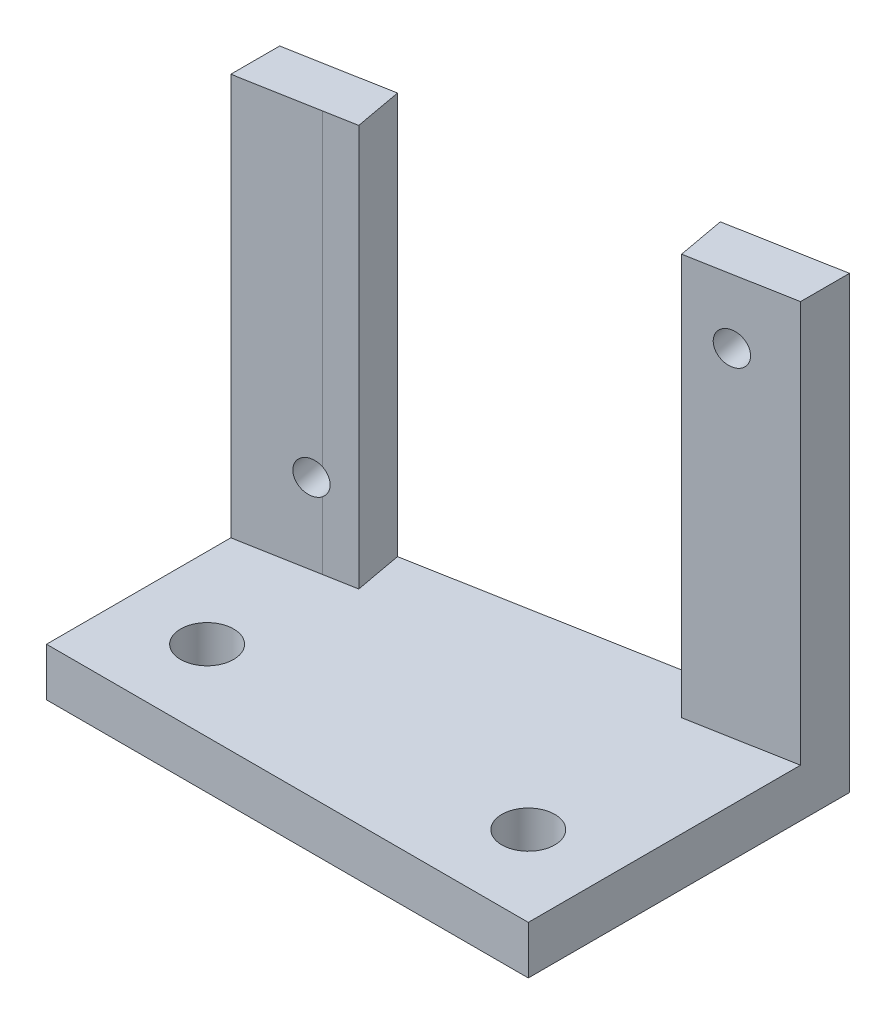
ISO-10303-21;
HEADER;
FILE_DESCRIPTION(('STEP AP214'),'2;1');
FILE_NAME('part.step','',(''),(''),'','','');
FILE_SCHEMA(('AUTOMOTIVE_DESIGN { 1 0 10303 214 1 1 1 1 }'));
ENDSEC;
DATA;
#1=APPLICATION_CONTEXT('core data for automotive mechanical design processes');
#2=APPLICATION_PROTOCOL_DEFINITION('international standard','automotive_design',2000,#1);
#3=PRODUCT_CONTEXT('',#1,'mechanical');
#4=PRODUCT('Part','Part','',(#3));
#5=PRODUCT_RELATED_PRODUCT_CATEGORY('part','',(#4));
#6=PRODUCT_DEFINITION_FORMATION('','',#4);
#7=PRODUCT_DEFINITION_CONTEXT('part definition',#1,'design');
#8=PRODUCT_DEFINITION('design','',#6,#7);
#9=PRODUCT_DEFINITION_SHAPE('','',#8);
#10=(LENGTH_UNIT() NAMED_UNIT(*) SI_UNIT(.MILLI.,.METRE.));
#11=(NAMED_UNIT(*) PLANE_ANGLE_UNIT() SI_UNIT($,.RADIAN.));
#12=(NAMED_UNIT(*) SI_UNIT($,.STERADIAN.) SOLID_ANGLE_UNIT());
#13=UNCERTAINTY_MEASURE_WITH_UNIT(LENGTH_MEASURE(1.E-05),#10,'distance_accuracy_value','');
#14=(GEOMETRIC_REPRESENTATION_CONTEXT(3) GLOBAL_UNCERTAINTY_ASSIGNED_CONTEXT((#13)) GLOBAL_UNIT_ASSIGNED_CONTEXT((#10,
#11,#12)) REPRESENTATION_CONTEXT('',''));
#15=CARTESIAN_POINT('',(0.,0.,0.));
#16=DIRECTION('',(0.,0.,1.));
#17=DIRECTION('',(1.,0.,0.));
#18=AXIS2_PLACEMENT_3D('',#15,#16,#17);
#19=CARTESIAN_POINT('',(-1.62852563895686,28.,-8.91157755402289));
#20=DIRECTION('',(0.179765710063965,0.,0.983709453794767));
#21=DIRECTION('',(0.983709453794767,0.,-0.179765710063965));
#22=AXIS2_PLACEMENT_3D('',#19,#20,#21);
#23=PLANE('',#22);
#24=DIRECTION('',(0.,-1.,0.));
#25=VECTOR('',#24,1.);
#26=CARTESIAN_POINT('',(-8.2550015506538,28.,-7.70063753215696));
#27=LINE('',#26,#25);
#28=CARTESIAN_POINT('',(-8.2550015506538,28.,-7.70063753215696));
#29=VERTEX_POINT('',#28);
#30=CARTESIAN_POINT('',(-8.2550015506538,3.,-7.70063753215696));
#31=VERTEX_POINT('',#30);
#32=EDGE_CURVE('E143',#29,#31,#27,.T.);
#33=ORIENTED_EDGE('',*,*,#32,.F.);
#34=DIRECTION('',(-0.983709453794767,0.,0.179765710063965));
#35=VECTOR('',#34,1.);
#36=CARTESIAN_POINT('',(-1.62852563895686,28.,-8.91157755402289));
#37=LINE('',#36,#35);
#38=CARTESIAN_POINT('',(-10.171425838547,28.,-7.3504250059197));
#39=VERTEX_POINT('',#38);
#40=EDGE_CURVE('E291',#29,#39,#37,.T.);
#41=ORIENTED_EDGE('',*,*,#40,.T.);
#42=DIRECTION('',(0.,-1.,0.));
#43=VECTOR('',#42,1.);
#44=CARTESIAN_POINT('',(-10.171425838547,28.,-7.3504250059197));
#45=LINE('',#44,#43);
#46=CARTESIAN_POINT('',(-10.171425838547,8.81160697400908,-7.3504250059197));
#47=VERTEX_POINT('',#46);
#48=EDGE_CURVE('E169',#39,#47,#45,.T.);
#49=ORIENTED_EDGE('',*,*,#48,.T.);
#50=CARTESIAN_POINT('',(-10.7461126730629,8.,-7.24540518886636));
#51=DIRECTION('',(0.179765710063965,0.,0.983709453794767));
#52=DIRECTION('',(0.983709453794767,0.,-0.179765710063965));
#53=AXIS2_PLACEMENT_3D('',#50,#51,#52);
#54=CIRCLE('',#53,1.);
#55=CARTESIAN_POINT('',(-10.171425838547,7.18839302599092,-7.35042500591969));
#56=VERTEX_POINT('',#55);
#57=EDGE_CURVE('E286',#56,#47,#54,.T.);
#58=ORIENTED_EDGE('',*,*,#57,.F.);
#59=CARTESIAN_POINT('',(-10.171425838547,3.,-7.3504250059197));
#60=VERTEX_POINT('',#59);
#61=EDGE_CURVE('E39',#56,#60,#45,.T.);
#62=ORIENTED_EDGE('',*,*,#61,.T.);
#63=DIRECTION('',(-0.983709453794767,0.,0.179765710063965));
#64=VECTOR('',#63,1.);
#65=CARTESIAN_POINT('',(-1.62852563895686,3.,-8.91157755402289));
#66=LINE('',#65,#64);
#67=EDGE_CURVE('E135',#31,#60,#66,.T.);
#68=ORIENTED_EDGE('',*,*,#67,.F.);
#69=EDGE_LOOP('',(#33,#41,#49,#58,#62,#68));
#70=FACE_BOUND('',#69,.T.);
#71=ADVANCED_FACE('F35',(#70),#23,.T.);
#72=CARTESIAN_POINT('',(0.,28.,0.));
#73=DIRECTION('',(0.,1.,0.));
#74=DIRECTION('',(0.,0.,1.));
#75=AXIS2_PLACEMENT_3D('',#72,#73,#74);
#76=PLANE('',#75);
#77=DIRECTION('',(0.179765710063965,0.,0.983709453794767));
#78=VECTOR('',#77,1.);
#79=CARTESIAN_POINT('',(-6.62647591169694,28.,1.21094002186594));
#80=LINE('',#79,#78);
#81=CARTESIAN_POINT('',(-8.79429868084569,28.,-10.6517658935413));
#82=VERTEX_POINT('',#81);
#83=EDGE_CURVE('E45',#82,#29,#80,.T.);
#84=ORIENTED_EDGE('',*,*,#83,.F.);
#85=DIRECTION('',(-0.983709453794767,0.,0.179765710063965));
#86=VECTOR('',#85,1.);
#87=CARTESIAN_POINT('',(-2.16782276914875,28.,-11.8627059154072));
#88=LINE('',#87,#86);
#89=CARTESIAN_POINT('',(-15.,28.,-9.51771935187266));
#90=VERTEX_POINT('',#89);
#91=EDGE_CURVE('E296',#82,#90,#88,.T.);
#92=ORIENTED_EDGE('',*,*,#91,.T.);
#93=DIRECTION('',(0.,0.,1.));
#94=VECTOR('',#93,1.);
#95=CARTESIAN_POINT('',(-15.,28.,0.));
#96=LINE('',#95,#94);
#97=CARTESIAN_POINT('',(-15.,28.,-6.47799790623274));
#98=VERTEX_POINT('',#97);
#99=EDGE_CURVE('E161',#90,#98,#96,.T.);
#100=ORIENTED_EDGE('',*,*,#99,.T.);
#101=DIRECTION('',(-0.984066429485255,0.,0.177801187735463));
#102=VECTOR('',#101,1.);
#103=CARTESIAN_POINT('',(-1.60764243892505,28.,-8.89772995845068));
#104=LINE('',#103,#102);
#105=EDGE_CURVE('E153',#39,#98,#104,.T.);
#106=ORIENTED_EDGE('',*,*,#105,.F.);
#107=ORIENTED_EDGE('',*,*,#40,.F.);
#108=EDGE_LOOP('',(#84,#92,#100,#106,#107));
#109=FACE_BOUND('',#108,.T.);
#110=ADVANCED_FACE('F203',(#109),#76,.T.);
#111=CARTESIAN_POINT('',(0.,3.,0.));
#112=DIRECTION('',(0.,-1.,0.));
#113=DIRECTION('',(0.,0.,-1.));
#114=AXIS2_PLACEMENT_3D('',#111,#112,#113);
#115=PLANE('',#114);
#116=CARTESIAN_POINT('',(15.,3.,-11.9503190312676));
#117=VERTEX_POINT('',#116);
#118=CARTESIAN_POINT('',(8.73968129504246,3.,-10.806291561691));
#119=VERTEX_POINT('',#118);
#120=EDGE_CURVE('E150',#117,#119,#66,.T.);
#121=ORIENTED_EDGE('',*,*,#120,.T.);
#122=DIRECTION('',(0.179765710063965,0.,0.983709453794767));
#123=VECTOR('',#122,1.);
#124=CARTESIAN_POINT('',(4.24553854344332,3.,-35.3990279065602));
#125=LINE('',#124,#123);
#126=CARTESIAN_POINT('',(8.20038416485056,3.,-13.7574199230753));
#127=VERTEX_POINT('',#126);
#128=EDGE_CURVE('E140',#127,#119,#125,.T.);
#129=ORIENTED_EDGE('',*,*,#128,.F.);
#130=DIRECTION('',(0.983709453794767,0.,-0.179765710063965));
#131=VECTOR('',#130,1.);
#132=CARTESIAN_POINT('',(-2.16782276914875,3.,-11.8627059154072));
#133=LINE('',#132,#131);
#134=CARTESIAN_POINT('',(-8.79429868084569,3.,-10.6517658935413));
#135=VERTEX_POINT('',#134);
#136=EDGE_CURVE('E11',#135,#127,#133,.T.);
#137=ORIENTED_EDGE('',*,*,#136,.F.);
#138=DIRECTION('',(0.179765710063965,0.,0.983709453794767));
#139=VECTOR('',#138,1.);
#140=CARTESIAN_POINT('',(-12.7491443022529,3.,-32.2933738770261));
#141=LINE('',#140,#139);
#142=EDGE_CURVE('E128',#135,#31,#141,.T.);
#143=ORIENTED_EDGE('',*,*,#142,.T.);
#144=ORIENTED_EDGE('',*,*,#67,.T.);
#145=DIRECTION('',(-0.984066429485255,0.,0.177801187735463));
#146=VECTOR('',#145,1.);
#147=CARTESIAN_POINT('',(-1.60764243892505,3.,-8.89772995845068));
#148=LINE('',#147,#146);
#149=CARTESIAN_POINT('',(-15.,3.,-6.47799790623274));
#150=VERTEX_POINT('',#149);
#151=EDGE_CURVE('E151',#60,#150,#148,.T.);
#152=ORIENTED_EDGE('',*,*,#151,.T.);
#153=DIRECTION('',(0.,0.,1.));
#154=VECTOR('',#153,1.);
#155=CARTESIAN_POINT('',(-15.,3.,5.));
#156=LINE('',#155,#154);
#157=CARTESIAN_POINT('',(-15.,3.,5.));
#158=VERTEX_POINT('',#157);
#159=EDGE_CURVE('E246',#150,#158,#156,.T.);
#160=ORIENTED_EDGE('',*,*,#159,.T.);
#161=DIRECTION('',(1.,0.,0.));
#162=VECTOR('',#161,1.);
#163=CARTESIAN_POINT('',(-15.,3.,5.));
#164=LINE('',#163,#162);
#165=CARTESIAN_POINT('',(15.,3.,5.));
#166=VERTEX_POINT('',#165);
#167=EDGE_CURVE('E243',#158,#166,#164,.T.);
#168=ORIENTED_EDGE('',*,*,#167,.T.);
#169=DIRECTION('',(0.,0.,-1.));
#170=VECTOR('',#169,1.);
#171=CARTESIAN_POINT('',(15.,3.,5.));
#172=LINE('',#171,#170);
#173=EDGE_CURVE('E241',#166,#117,#172,.T.);
#174=ORIENTED_EDGE('',*,*,#173,.T.);
#175=EDGE_LOOP('',(#121,#129,#137,#143,#144,#152,#160,#168,#174));
#176=FACE_BOUND('',#175,.T.);
#177=CARTESIAN_POINT('',(10.,3.,0.));
#178=DIRECTION('',(0.,1.,0.));
#179=DIRECTION('',(0.,0.,1.));
#180=AXIS2_PLACEMENT_3D('',#177,#178,#179);
#181=CIRCLE('',#180,1.65);
#182=CARTESIAN_POINT('',(10.,3.,1.65));
#183=VERTEX_POINT('',#182);
#184=EDGE_CURVE('E261',#183,#183,#181,.T.);
#185=ORIENTED_EDGE('',*,*,#184,.F.);
#186=EDGE_LOOP('',(#185));
#187=FACE_BOUND('',#186,.T.);
#188=CARTESIAN_POINT('',(-10.,3.,0.));
#189=DIRECTION('',(0.,1.,0.));
#190=DIRECTION('',(0.,0.,1.));
#191=AXIS2_PLACEMENT_3D('',#188,#189,#190);
#192=CIRCLE('',#191,1.65);
#193=CARTESIAN_POINT('',(-10.,3.,1.65));
#194=VERTEX_POINT('',#193);
#195=EDGE_CURVE('E166',#194,#194,#192,.T.);
#196=ORIENTED_EDGE('',*,*,#195,.F.);
#197=EDGE_LOOP('',(#196));
#198=FACE_BOUND('',#197,.T.);
#199=ADVANCED_FACE('F131',(#176,#187,#198),#115,.F.);
#200=CARTESIAN_POINT('',(0.,0.,0.));
#201=DIRECTION('',(0.,-1.,0.));
#202=DIRECTION('',(0.,0.,-1.));
#203=AXIS2_PLACEMENT_3D('',#200,#201,#202);
#204=PLANE('',#203);
#205=DIRECTION('',(-0.983709453794767,0.,0.179765710063966));
#206=VECTOR('',#205,1.);
#207=CARTESIAN_POINT('',(-2.16782276914875,0.,-11.8627059154072));
#208=LINE('',#207,#206);
#209=CARTESIAN_POINT('',(15.,0.,-15.));
#210=VERTEX_POINT('',#209);
#211=CARTESIAN_POINT('',(-15.,0.,-9.51771935187266));
#212=VERTEX_POINT('',#211);
#213=EDGE_CURVE('E154',#210,#212,#208,.T.);
#214=ORIENTED_EDGE('',*,*,#213,.F.);
#215=DIRECTION('',(0.,0.,-1.));
#216=VECTOR('',#215,1.);
#217=CARTESIAN_POINT('',(15.,0.,5.));
#218=LINE('',#217,#216);
#219=CARTESIAN_POINT('',(15.,0.,5.));
#220=VERTEX_POINT('',#219);
#221=EDGE_CURVE('E258',#220,#210,#218,.T.);
#222=ORIENTED_EDGE('',*,*,#221,.F.);
#223=DIRECTION('',(1.,0.,0.));
#224=VECTOR('',#223,1.);
#225=CARTESIAN_POINT('',(-15.,0.,5.));
#226=LINE('',#225,#224);
#227=CARTESIAN_POINT('',(-15.,0.,5.));
#228=VERTEX_POINT('',#227);
#229=EDGE_CURVE('E247',#228,#220,#226,.T.);
#230=ORIENTED_EDGE('',*,*,#229,.F.);
#231=DIRECTION('',(0.,0.,1.));
#232=VECTOR('',#231,1.);
#233=CARTESIAN_POINT('',(-15.,0.,5.));
#234=LINE('',#233,#232);
#235=EDGE_CURVE('E250',#212,#228,#234,.T.);
#236=ORIENTED_EDGE('',*,*,#235,.F.);
#237=EDGE_LOOP('',(#214,#222,#230,#236));
#238=FACE_BOUND('',#237,.T.);
#239=CARTESIAN_POINT('',(10.,0.,0.));
#240=DIRECTION('',(0.,1.,0.));
#241=DIRECTION('',(0.,0.,1.));
#242=AXIS2_PLACEMENT_3D('',#239,#240,#241);
#243=CIRCLE('',#242,1.65);
#244=CARTESIAN_POINT('',(10.,0.,1.65));
#245=VERTEX_POINT('',#244);
#246=EDGE_CURVE('E253',#245,#245,#243,.T.);
#247=ORIENTED_EDGE('',*,*,#246,.T.);
#248=EDGE_LOOP('',(#247));
#249=FACE_BOUND('',#248,.T.);
#250=CARTESIAN_POINT('',(-10.,0.,0.));
#251=DIRECTION('',(0.,1.,0.));
#252=DIRECTION('',(0.,0.,1.));
#253=AXIS2_PLACEMENT_3D('',#250,#251,#252);
#254=CIRCLE('',#253,1.65);
#255=CARTESIAN_POINT('',(-10.,0.,1.65));
#256=VERTEX_POINT('',#255);
#257=EDGE_CURVE('E172',#256,#256,#254,.T.);
#258=ORIENTED_EDGE('',*,*,#257,.T.);
#259=EDGE_LOOP('',(#258));
#260=FACE_BOUND('',#259,.T.);
#261=ADVANCED_FACE('F202',(#238,#249,#260),#204,.T.);
#262=CARTESIAN_POINT('',(15.,3.,5.));
#263=DIRECTION('',(-1.,0.,0.));
#264=DIRECTION('',(0.,0.,1.));
#265=AXIS2_PLACEMENT_3D('',#262,#263,#264);
#266=PLANE('',#265);
#267=ORIENTED_EDGE('',*,*,#221,.T.);
#268=DIRECTION('',(0.,-1.,0.));
#269=VECTOR('',#268,1.);
#270=CARTESIAN_POINT('',(15.,3.,-15.));
#271=LINE('',#270,#269);
#272=CARTESIAN_POINT('',(15.,28.,-15.));
#273=VERTEX_POINT('',#272);
#274=EDGE_CURVE('E267',#273,#210,#271,.T.);
#275=ORIENTED_EDGE('',*,*,#274,.F.);
#276=DIRECTION('',(0.,0.,-1.));
#277=VECTOR('',#276,1.);
#278=CARTESIAN_POINT('',(15.,28.,0.));
#279=LINE('',#278,#277);
#280=CARTESIAN_POINT('',(15.,28.,-11.9503190312676));
#281=VERTEX_POINT('',#280);
#282=EDGE_CURVE('E293',#281,#273,#279,.T.);
#283=ORIENTED_EDGE('',*,*,#282,.F.);
#284=DIRECTION('',(0.,-1.,0.));
#285=VECTOR('',#284,1.);
#286=CARTESIAN_POINT('',(15.,28.,-11.9503190312676));
#287=LINE('',#286,#285);
#288=EDGE_CURVE('E163',#281,#117,#287,.T.);
#289=ORIENTED_EDGE('',*,*,#288,.T.);
#290=ORIENTED_EDGE('',*,*,#173,.F.);
#291=DIRECTION('',(0.,-1.,0.));
#292=VECTOR('',#291,1.);
#293=CARTESIAN_POINT('',(15.,3.,5.));
#294=LINE('',#293,#292);
#295=EDGE_CURVE('E257',#166,#220,#294,.T.);
#296=ORIENTED_EDGE('',*,*,#295,.T.);
#297=EDGE_LOOP('',(#267,#275,#283,#289,#290,#296));
#298=FACE_BOUND('',#297,.T.);
#299=ADVANCED_FACE('F37',(#298),#266,.F.);
#300=CARTESIAN_POINT('',(-15.,3.,5.));
#301=DIRECTION('',(1.,0.,0.));
#302=DIRECTION('',(0.,0.,-1.));
#303=AXIS2_PLACEMENT_3D('',#300,#301,#302);
#304=PLANE('',#303);
#305=DIRECTION('',(0.,-1.,0.));
#306=VECTOR('',#305,1.);
#307=CARTESIAN_POINT('',(-15.,28.,-9.51771935187266));
#308=LINE('',#307,#306);
#309=EDGE_CURVE('E160',#90,#212,#308,.T.);
#310=ORIENTED_EDGE('',*,*,#309,.T.);
#311=ORIENTED_EDGE('',*,*,#235,.T.);
#312=DIRECTION('',(0.,-1.,0.));
#313=VECTOR('',#312,1.);
#314=CARTESIAN_POINT('',(-15.,3.,5.));
#315=LINE('',#314,#313);
#316=EDGE_CURVE('E264',#158,#228,#315,.T.);
#317=ORIENTED_EDGE('',*,*,#316,.F.);
#318=ORIENTED_EDGE('',*,*,#159,.F.);
#319=DIRECTION('',(0.,-1.,0.));
#320=VECTOR('',#319,1.);
#321=CARTESIAN_POINT('',(-15.,28.,-6.47799790623274));
#322=LINE('',#321,#320);
#323=EDGE_CURVE('E158',#98,#150,#322,.T.);
#324=ORIENTED_EDGE('',*,*,#323,.F.);
#325=ORIENTED_EDGE('',*,*,#99,.F.);
#326=EDGE_LOOP('',(#310,#311,#317,#318,#324,#325));
#327=FACE_BOUND('',#326,.T.);
#328=ADVANCED_FACE('F208',(#327),#304,.F.);
#329=CARTESIAN_POINT('',(-15.,3.,5.));
#330=DIRECTION('',(0.,0.,-1.));
#331=DIRECTION('',(-1.,0.,0.));
#332=AXIS2_PLACEMENT_3D('',#329,#330,#331);
#333=PLANE('',#332);
#334=ORIENTED_EDGE('',*,*,#229,.T.);
#335=ORIENTED_EDGE('',*,*,#295,.F.);
#336=ORIENTED_EDGE('',*,*,#167,.F.);
#337=ORIENTED_EDGE('',*,*,#316,.T.);
#338=EDGE_LOOP('',(#334,#335,#336,#337));
#339=FACE_BOUND('',#338,.T.);
#340=ADVANCED_FACE('F198',(#339),#333,.F.);
#341=CARTESIAN_POINT('',(10.,3.,0.));
#342=DIRECTION('',(0.,-1.,0.));
#343=DIRECTION('',(0.,0.,-1.));
#344=AXIS2_PLACEMENT_3D('',#341,#342,#343);
#345=CYLINDRICAL_SURFACE('',#344,1.65);
#346=ORIENTED_EDGE('',*,*,#184,.T.);
#347=EDGE_LOOP('',(#346));
#348=FACE_BOUND('',#347,.T.);
#349=ORIENTED_EDGE('',*,*,#246,.F.);
#350=EDGE_LOOP('',(#349));
#351=FACE_BOUND('',#350,.T.);
#352=ADVANCED_FACE('F194',(#348,#351),#345,.F.);
#353=CARTESIAN_POINT('',(-10.,3.,0.));
#354=DIRECTION('',(0.,-1.,0.));
#355=DIRECTION('',(0.,0.,-1.));
#356=AXIS2_PLACEMENT_3D('',#353,#354,#355);
#357=CYLINDRICAL_SURFACE('',#356,1.65);
#358=ORIENTED_EDGE('',*,*,#195,.T.);
#359=EDGE_LOOP('',(#358));
#360=FACE_BOUND('',#359,.T.);
#361=ORIENTED_EDGE('',*,*,#257,.F.);
#362=EDGE_LOOP('',(#361));
#363=FACE_BOUND('',#362,.T.);
#364=ADVANCED_FACE('F189',(#360,#363),#357,.F.);
#365=CARTESIAN_POINT('',(-1.60764243892505,28.,-8.89772995845068));
#366=DIRECTION('',(0.177801187735463,0.,0.984066429485255));
#367=DIRECTION('',(0.984066429485255,0.,-0.177801187735463));
#368=AXIS2_PLACEMENT_3D('',#365,#366,#367);
#369=PLANE('',#368);
#370=CARTESIAN_POINT('',(-10.171425838547,8.81160697400908,-7.35042500591969));
#371=CARTESIAN_POINT('',(-10.1805552303211,8.81828490339817,-7.34877550690207));
#372=CARTESIAN_POINT('',(-10.1897973194341,8.82480363014352,-7.34710526615628));
#373=CARTESIAN_POINT('',(-10.208495829895,8.83751531520933,-7.34372532278814));
#374=CARTESIAN_POINT('',(-10.2179522512342,8.84370827354297,-7.34201562016737));
#375=CARTESIAN_POINT('',(-10.2370683640643,8.85576105894911,-7.3385587745641));
#376=CARTESIAN_POINT('',(-10.246728055547,8.86162088603486,-7.3368116315831));
#377=CARTESIAN_POINT('',(-10.2662393399621,8.87300054045348,-7.33328198280649));
#378=CARTESIAN_POINT('',(-10.276090932887,8.87852036779964,-7.33149947701227));
#379=CARTESIAN_POINT('',(-10.2959744438779,8.8892135265288,-7.327901218095));
#380=CARTESIAN_POINT('',(-10.306006361937,8.89438685792513,-7.32608546497322));
#381=CARTESIAN_POINT('',(-10.3262387299448,8.90438094333499,-7.3224228665313));
#382=CARTESIAN_POINT('',(-10.3364391798871,8.90920169736186,-7.32057602121233));
#383=CARTESIAN_POINT('',(-10.3569966214826,8.918484959211,-7.31685342949355));
#384=CARTESIAN_POINT('',(-10.36735361313,8.92294746704658,-7.31497768309481));
#385=CARTESIAN_POINT('',(-10.3882119634804,8.93150898945834,-7.31119951404567));
#386=CARTESIAN_POINT('',(-10.3987133221782,8.93560800404779,-7.30929709139625));
#387=CARTESIAN_POINT('',(-10.419848062255,8.94343772017829,-7.30546782568996));
#388=CARTESIAN_POINT('',(-10.4304814436292,8.94716842173257,-7.30354098263395));
#389=CARTESIAN_POINT('',(-10.4518677293613,8.9542571251166,-7.29966516034282));
#390=CARTESIAN_POINT('',(-10.4626206337149,8.95761512695949,-7.29771618110847));
#391=CARTESIAN_POINT('',(-10.4842333251148,8.96395448246729,-7.2937983963814));
#392=CARTESIAN_POINT('',(-10.4950931121574,8.96693583614524,-7.29182959088937));
#393=CARTESIAN_POINT('',(-10.5169068029048,8.97251838974805,-7.28787448654565));
#394=CARTESIAN_POINT('',(-10.5278607066064,8.97511958968582,-7.28588818769455));
#395=CARTESIAN_POINT('',(-10.5498497539155,8.97993877722995,-7.28190044976578));
#396=CARTESIAN_POINT('',(-10.5608848975202,8.98215676484909,-7.27989901068862));
#397=CARTESIAN_POINT('',(-10.583023452293,8.98620691977179,-7.27588336290845));
#398=CARTESIAN_POINT('',(-10.5941268634589,8.98803908708797,-7.27386915420586));
#399=CARTESIAN_POINT('',(-10.6163889006791,8.99131544708104,-7.26983035245574));
#400=CARTESIAN_POINT('',(-10.6275475267318,8.99275963977036,-7.26780575940853));
#401=CARTESIAN_POINT('',(-10.649906876066,8.99525835237962,-7.26374858612553));
#402=CARTESIAN_POINT('',(-10.6611075993463,8.9963128723118,-7.26171600588999));
#403=CARTESIAN_POINT('',(-10.6835379759159,8.99803099946701,-7.25764526444351));
#404=CARTESIAN_POINT('',(-10.6947676292043,8.99869460670207,-7.25560710323274));
#405=CARTESIAN_POINT('',(-10.717242664492,8.99963012817159,-7.2515276122765));
#406=CARTESIAN_POINT('',(-10.7284880464909,8.99990204241786,-7.24948628253112));
#407=CARTESIAN_POINT('',(-10.7509813193459,9.00005385818412,-7.24540287033724));
#408=CARTESIAN_POINT('',(-10.762229210202,8.99993375971568,-7.24336078788876));
#409=CARTESIAN_POINT('',(-10.7847142779068,8.9993016912686,-7.23927828667053));
#410=CARTESIAN_POINT('',(-10.7959514547558,8.99878972130126,-7.23723786790073));
#411=CARTESIAN_POINT('',(-10.8184018841185,8.99737451184816,-7.2331611081307));
#412=CARTESIAN_POINT('',(-10.8296151366328,8.99647127237342,-7.23112476713036));
#413=CARTESIAN_POINT('',(-10.8520045350679,8.99427458596512,-7.22705857186056));
#414=CARTESIAN_POINT('',(-10.8631806809897,8.99298113904231,-7.22502871759091));
#415=CARTESIAN_POINT('',(-10.8854827275516,8.99000555861649,-7.22097789678167));
#416=CARTESIAN_POINT('',(-10.8966086281932,8.98832342512395,-7.21895693024183));
#417=CARTESIAN_POINT('',(-10.9187971045253,8.98457244946806,-7.21492627510612));
#418=CARTESIAN_POINT('',(-10.9298596802177,8.98250360731488,-7.21291658650995));
#419=CARTESIAN_POINT('',(-10.9519085013808,8.97798164695213,-7.2089108638797));
#420=CARTESIAN_POINT('',(-10.9628947468536,8.97552852875242,-7.20691482984528));
#421=CARTESIAN_POINT('',(-10.9847779919972,8.97024090075574,-7.2029387765664));
#422=CARTESIAN_POINT('',(-10.9956749916703,8.96740639096831,-7.20095875732153));
#423=CARTESIAN_POINT('',(-11.0173669345115,8.96135931270835,-7.19701707468411));
#424=CARTESIAN_POINT('',(-11.0281618776821,8.95814674424504,-7.1950554112911));
#425=CARTESIAN_POINT('',(-11.0496370167552,8.95134732607961,-7.19115275950152));
#426=CARTESIAN_POINT('',(-11.0603172126605,8.94776047638637,-7.18921177110446));
#427=CARTESIAN_POINT('',(-11.0815503013028,8.9402167132998,-7.18535276380575));
#428=CARTESIAN_POINT('',(-11.0921031940427,8.93625979991502,-7.18343474490358));
#429=CARTESIAN_POINT('',(-11.11306927008,8.92798056211742,-7.17962394375057));
#430=CARTESIAN_POINT('',(-11.1234824533805,8.9236582377128,-7.17773116149915));
#431=CARTESIAN_POINT('',(-11.1441568684786,8.91465326021014,-7.17397307079466));
#432=CARTESIAN_POINT('',(-11.1544181002796,8.90997060711996,-7.17210776234098));
#433=CARTESIAN_POINT('',(-11.1747765489268,8.90025047826736,-7.16840682373957));
#434=CARTESIAN_POINT('',(-11.1848737657766,8.89521300251245,-7.1665711935912));
#435=CARTESIAN_POINT('',(-11.2048923138628,8.88478915156401,-7.16293178087649));
#436=CARTESIAN_POINT('',(-11.2148136451029,8.87940277637763,-7.16112799830949));
#437=CARTESIAN_POINT('',(-11.2344687580622,8.86828746004752,-7.15755441225134));
#438=CARTESIAN_POINT('',(-11.244202539785,8.86255851891059,-7.15578460875951));
#439=CARTESIAN_POINT('',(-11.2634711102682,8.85076480696123,-7.15228107205703));
#440=CARTESIAN_POINT('',(-11.2730058990322,8.84470003615525,-7.15054733884566));
#441=CARTESIAN_POINT('',(-11.2918652740774,8.8322417960294,-7.14711799116198));
#442=CARTESIAN_POINT('',(-11.3011898603624,8.82584832671565,-7.14542237668895));
#443=CARTESIAN_POINT('',(-11.3196178680312,8.81274020723065,-7.1420712697837));
#444=CARTESIAN_POINT('',(-11.3287212894189,8.80602555706518,-7.14041577735077));
#445=CARTESIAN_POINT('',(-11.3466962648667,8.79228297118835,-7.1371468703159));
#446=CARTESIAN_POINT('',(-11.3555678189307,8.78525503548242,-7.13553345571323));
#447=CARTESIAN_POINT('',(-11.3730686298812,8.77089414220798,-7.13235061031774));
#448=CARTESIAN_POINT('',(-11.3816978867715,8.76356118464455,-7.13078117952417));
#449=CARTESIAN_POINT('',(-11.3987039583643,8.74859886999332,-7.12768815567332));
#450=CARTESIAN_POINT('',(-11.4070807730708,8.74096951291028,-7.12616456261529));
#451=CARTESIAN_POINT('',(-11.4235721120546,8.72542337007456,-7.1231650139296));
#452=CARTESIAN_POINT('',(-11.4316866363359,8.71750658432631,-7.1216890583012));
#453=CARTESIAN_POINT('',(-11.4476438545768,8.7013948929832,-7.11878652782036));
#454=CARTESIAN_POINT('',(-11.4554865485404,8.69319998739243,-7.1173599529672));
#455=CARTESIAN_POINT('',(-11.4708908858192,8.67654169220995,-7.1145578689841));
#456=CARTESIAN_POINT('',(-11.4784525291385,8.66807830262201,-7.11318235985345));
#457=CARTESIAN_POINT('',(-11.4932858752098,8.65089299098334,-7.11048403188303));
#458=CARTESIAN_POINT('',(-11.5005575779659,8.64217106893608,-7.10916121304255));
#459=CARTESIAN_POINT('',(-11.5148024938525,8.62447894790806,-7.10656982793038));
#460=CARTESIAN_POINT('',(-11.5217757069871,8.61550874893048,-7.10530126165799));
#461=CARTESIAN_POINT('',(-11.5354154454855,8.59733062150347,-7.10281987983307));
#462=CARTESIAN_POINT('',(-11.5420819708532,8.58812269305694,-7.10160706427986));
#463=CARTESIAN_POINT('',(-11.5551004962254,8.56947993368394,-7.09923861615606));
#464=CARTESIAN_POINT('',(-11.5614524962336,8.5600451027601,-7.0980829835848));
#465=CARTESIAN_POINT('',(-11.5738345030625,8.54095963222398,-7.09583026611519));
#466=CARTESIAN_POINT('',(-11.5798645098867,8.53130899261404,-7.09473318121619));
#467=CARTESIAN_POINT('',(-11.5915954410727,8.51180325225231,-7.09259885460427));
#468=CARTESIAN_POINT('',(-11.5972963654378,8.50194815150261,-7.09156161289073));
#469=CARTESIAN_POINT('',(-11.6083624293155,8.48204507682017,-7.0895481974625));
#470=CARTESIAN_POINT('',(-11.6137275688314,8.47199710288929,-7.08857202374722));
#471=CARTESIAN_POINT('',(-11.6241157553866,8.45172009659009,-7.08668189698768));
#472=CARTESIAN_POINT('',(-11.629138802429,8.44149106422339,-7.08576794394285));
#473=CARTESIAN_POINT('',(-11.6388368985958,8.42086396869273,-7.08400333770046));
#474=CARTESIAN_POINT('',(-11.6435119477232,8.41046590553018,-7.08315268450238));
#475=CARTESIAN_POINT('',(-11.652508551745,8.38951297480005,-7.08151568236481));
#476=CARTESIAN_POINT('',(-11.6568301066422,8.37895810723368,-7.08072933342485));
#477=CARTESIAN_POINT('',(-11.665114641478,8.35770397846404,-7.07922186826901));
#478=CARTESIAN_POINT('',(-11.6690776214192,8.34700471726179,-7.07850075205268));
#479=CARTESIAN_POINT('',(-11.6766403471805,8.32547438177137,-7.07712460377197));
#480=CARTESIAN_POINT('',(-11.680240093003,8.31464330748406,-7.07646957170717));
#481=CARTESIAN_POINT('',(-11.6870721184064,8.29286208136475,-7.07522636511864));
#482=CARTESIAN_POINT('',(-11.6903043979894,8.28191192953344,-7.07463819059452));
#483=CARTESIAN_POINT('',(-11.6963976908111,8.25990542388275,-7.07352939352833));
#484=CARTESIAN_POINT('',(-11.6992587040517,8.2488490700639,-7.07300877098592));
#485=CARTESIAN_POINT('',(-11.704606100572,8.22664316087058,-7.07203569255944));
#486=CARTESIAN_POINT('',(-11.7070924838535,8.21549360549652,-7.07158323667508));
#487=CARTESIAN_POINT('',(-11.7116876972805,8.19311440321469,-7.07074702575359));
#488=CARTESIAN_POINT('',(-11.7137965274275,8.18188475630724,-7.0703632707162));
#489=CARTESIAN_POINT('',(-11.7176341552891,8.1593585751549,-7.06966491456199));
#490=CARTESIAN_POINT('',(-11.7193629530048,8.14806204091022,-7.06935031344495));
#491=CARTESIAN_POINT('',(-11.7224384835008,8.12541536792803,-7.06879063655648));
#492=CARTESIAN_POINT('',(-11.7237852162821,8.11406522919065,-7.06854556078486));
#493=CARTESIAN_POINT('',(-11.72609503359,8.09132469309761,-7.06812522392728));
#494=CARTESIAN_POINT('',(-11.7270581181174,8.07993429574203,-7.06794996284117));
#495=CARTESIAN_POINT('',(-11.7285995066434,8.05712663562455,-7.06766946226937));
#496=CARTESIAN_POINT('',(-11.7291778106426,8.0457093728627,-7.06756422278359));
#497=CARTESIAN_POINT('',(-11.729948958215,8.02286140673389,-7.0674238896587));
#498=CARTESIAN_POINT('',(-11.7301418017885,8.01143070336694,-7.06738879601955));
#499=CARTESIAN_POINT('',(-11.7301418017885,7.98856929663304,-7.06738879601955));
#500=CARTESIAN_POINT('',(-11.729948958215,7.97713859326609,-7.0674238896587));
#501=CARTESIAN_POINT('',(-11.7291778106426,7.95429062713728,-7.06756422278359));
#502=CARTESIAN_POINT('',(-11.7285995066434,7.94287336437543,-7.06766946226937));
#503=CARTESIAN_POINT('',(-11.7270581181174,7.92006570425795,-7.06794996284117));
#504=CARTESIAN_POINT('',(-11.72609503359,7.90867530690237,-7.06812522392728));
#505=CARTESIAN_POINT('',(-11.7237852162821,7.88593477080933,-7.06854556078486));
#506=CARTESIAN_POINT('',(-11.7224384835008,7.87458463207195,-7.06879063655648));
#507=CARTESIAN_POINT('',(-11.7193629530048,7.85193795908976,-7.06935031344495));
#508=CARTESIAN_POINT('',(-11.7176341552891,7.84064142484508,-7.06966491456199));
#509=CARTESIAN_POINT('',(-11.7137965274275,7.81811524369274,-7.0703632707162));
#510=CARTESIAN_POINT('',(-11.7116876972805,7.80688559678529,-7.07074702575359));
#511=CARTESIAN_POINT('',(-11.7070924838535,7.78450639450347,-7.07158323667508));
#512=CARTESIAN_POINT('',(-11.704606100572,7.7733568391294,-7.07203569255945));
#513=CARTESIAN_POINT('',(-11.6992587040517,7.75115092993608,-7.07300877098592));
#514=CARTESIAN_POINT('',(-11.6963976908111,7.74009457611723,-7.07352939352833));
#515=CARTESIAN_POINT('',(-11.6903043979894,7.71808807046654,-7.07463819059452));
#516=CARTESIAN_POINT('',(-11.6870721184064,7.70713791863523,-7.07522636511864));
#517=CARTESIAN_POINT('',(-11.680240093003,7.68535669251592,-7.07646957170717));
#518=CARTESIAN_POINT('',(-11.6766403471805,7.67452561822861,-7.07712460377197));
#519=CARTESIAN_POINT('',(-11.6690776214192,7.65299528273819,-7.07850075205268));
#520=CARTESIAN_POINT('',(-11.665114641478,7.64229602153594,-7.07922186826901));
#521=CARTESIAN_POINT('',(-11.6568301066422,7.6210418927663,-7.08072933342485));
#522=CARTESIAN_POINT('',(-11.652508551745,7.61048702519993,-7.08151568236482));
#523=CARTESIAN_POINT('',(-11.6435119477232,7.5895340944698,-7.08315268450238));
#524=CARTESIAN_POINT('',(-11.6388368985958,7.57913603130725,-7.08400333770047));
#525=CARTESIAN_POINT('',(-11.629138802429,7.55850893577659,-7.08576794394285));
#526=CARTESIAN_POINT('',(-11.6241157553866,7.5482799034099,-7.08668189698768));
#527=CARTESIAN_POINT('',(-11.6137275688314,7.52800289711069,-7.08857202374722));
#528=CARTESIAN_POINT('',(-11.6083624293155,7.51795492317981,-7.0895481974625));
#529=CARTESIAN_POINT('',(-11.5972963654378,7.49805184849737,-7.09156161289073));
#530=CARTESIAN_POINT('',(-11.5915954410727,7.48819674774767,-7.09259885460427));
#531=CARTESIAN_POINT('',(-11.5798645098867,7.46869100738594,-7.0947331812162));
#532=CARTESIAN_POINT('',(-11.5738345030625,7.45904036777601,-7.09583026611519));
#533=CARTESIAN_POINT('',(-11.5614524962336,7.43995489723988,-7.09808298358481));
#534=CARTESIAN_POINT('',(-11.5551004962254,7.43052006631604,-7.09923861615606));
#535=CARTESIAN_POINT('',(-11.5420819708532,7.41187730694305,-7.10160706427986));
#536=CARTESIAN_POINT('',(-11.5354154454855,7.40266937849651,-7.10281987983307));
#537=CARTESIAN_POINT('',(-11.521775706987,7.3844912510695,-7.10530126165799));
#538=CARTESIAN_POINT('',(-11.5148024938525,7.37552105209192,-7.10656982793038));
#539=CARTESIAN_POINT('',(-11.5005575779658,7.3578289310639,-7.10916121304256));
#540=CARTESIAN_POINT('',(-11.4932858752098,7.34910700901665,-7.11048403188303));
#541=CARTESIAN_POINT('',(-11.4784525291385,7.33192169737797,-7.11318235985345));
#542=CARTESIAN_POINT('',(-11.4708908858192,7.32345830779004,-7.11455786898411));
#543=CARTESIAN_POINT('',(-11.4554865485403,7.30680001260755,-7.11735995296721));
#544=CARTESIAN_POINT('',(-11.4476438545768,7.29860510701679,-7.11878652782037));
#545=CARTESIAN_POINT('',(-11.4316866363359,7.28249341567367,-7.1216890583012));
#546=CARTESIAN_POINT('',(-11.4235721120546,7.27457662992542,-7.1231650139296));
#547=CARTESIAN_POINT('',(-11.4070807730708,7.25903048708971,-7.1261645626153));
#548=CARTESIAN_POINT('',(-11.3987039583643,7.25140113000667,-7.12768815567332));
#549=CARTESIAN_POINT('',(-11.3816978867715,7.23643881535544,-7.13078117952418));
#550=CARTESIAN_POINT('',(-11.3730686298811,7.22910585779201,-7.13235061031774));
#551=CARTESIAN_POINT('',(-11.3555678189307,7.21474496451757,-7.13553345571323));
#552=CARTESIAN_POINT('',(-11.3466962648667,7.20771702881164,-7.1371468703159));
#553=CARTESIAN_POINT('',(-11.3287212894189,7.19397444293481,-7.14041577735077));
#554=CARTESIAN_POINT('',(-11.3196178680312,7.18725979276933,-7.14207126978371));
#555=CARTESIAN_POINT('',(-11.3011898603624,7.17415167328434,-7.14542237668895));
#556=CARTESIAN_POINT('',(-11.2918652740774,7.16775820397059,-7.14711799116199));
#557=CARTESIAN_POINT('',(-11.2730058990322,7.15529996384474,-7.15054733884567));
#558=CARTESIAN_POINT('',(-11.2634711102682,7.14923519303876,-7.15228107205703));
#559=CARTESIAN_POINT('',(-11.244202539785,7.1374414810894,-7.15578460875952));
#560=CARTESIAN_POINT('',(-11.2344687580621,7.13171253995247,-7.15755441225134));
#561=CARTESIAN_POINT('',(-11.2148136451029,7.12059722362236,-7.16112799830949));
#562=CARTESIAN_POINT('',(-11.2048923138628,7.11521084843599,-7.16293178087649));
#563=CARTESIAN_POINT('',(-11.1848737657766,7.10478699748754,-7.1665711935912));
#564=CARTESIAN_POINT('',(-11.1747765489268,7.09974952173263,-7.16840682373956));
#565=CARTESIAN_POINT('',(-11.1544181002796,7.09002939288003,-7.17210776234098));
#566=CARTESIAN_POINT('',(-11.1441568684786,7.08534673978985,-7.17397307079466));
#567=CARTESIAN_POINT('',(-11.1234824533805,7.07634176228719,-7.17773116149916));
#568=CARTESIAN_POINT('',(-11.11306927008,7.07201943788258,-7.17962394375057));
#569=CARTESIAN_POINT('',(-11.0921031940427,7.06374020008497,-7.18343474490359));
#570=CARTESIAN_POINT('',(-11.0815503013028,7.05978328670019,-7.18535276380576));
#571=CARTESIAN_POINT('',(-11.0603172126605,7.05223952361362,-7.18921177110446));
#572=CARTESIAN_POINT('',(-11.0496370167552,7.04865267392038,-7.19115275950153));
#573=CARTESIAN_POINT('',(-11.0281618776821,7.04185325575495,-7.19505541129111));
#574=CARTESIAN_POINT('',(-11.0173669345115,7.03864068729164,-7.19701707468411));
#575=CARTESIAN_POINT('',(-10.9956749916703,7.03259360903169,-7.20095875732154));
#576=CARTESIAN_POINT('',(-10.9847779919972,7.02975909924426,-7.2029387765664));
#577=CARTESIAN_POINT('',(-10.9628947468535,7.02447147124757,-7.20691482984528));
#578=CARTESIAN_POINT('',(-10.9519085013808,7.02201835304786,-7.2089108638797));
#579=CARTESIAN_POINT('',(-10.9298596802177,7.01749639268511,-7.21291658650995));
#580=CARTESIAN_POINT('',(-10.9187971045253,7.01542755053193,-7.21492627510612));
#581=CARTESIAN_POINT('',(-10.8966086281931,7.01167657487604,-7.21895693024183));
#582=CARTESIAN_POINT('',(-10.8854827275516,7.00999444138351,-7.22097789678167));
#583=CARTESIAN_POINT('',(-10.8631806809897,7.00701886095769,-7.22502871759091));
#584=CARTESIAN_POINT('',(-10.8520045350679,7.00572541403488,-7.22705857186056));
#585=CARTESIAN_POINT('',(-10.8296151366328,7.00352872762657,-7.23112476713036));
#586=CARTESIAN_POINT('',(-10.8184018841185,7.00262548815184,-7.23316110813071));
#587=CARTESIAN_POINT('',(-10.7959514547558,7.00121027869873,-7.23723786790073));
#588=CARTESIAN_POINT('',(-10.7847142779068,7.0006983087314,-7.23927828667053));
#589=CARTESIAN_POINT('',(-10.762229210202,7.00006624028432,-7.24336078788876));
#590=CARTESIAN_POINT('',(-10.7509813193459,6.99994614181588,-7.24540287033724));
#591=CARTESIAN_POINT('',(-10.7284880464909,7.00009795758214,-7.24948628253112));
#592=CARTESIAN_POINT('',(-10.717242664492,7.0003698718284,-7.2515276122765));
#593=CARTESIAN_POINT('',(-10.6947676292043,7.00130539329793,-7.25560710323274));
#594=CARTESIAN_POINT('',(-10.6835379759159,7.00196900053299,-7.25764526444351));
#595=CARTESIAN_POINT('',(-10.6611075993463,7.0036871276882,-7.26171600588999));
#596=CARTESIAN_POINT('',(-10.649906876066,7.00474164762038,-7.26374858612553));
#597=CARTESIAN_POINT('',(-10.6275475267318,7.00724036022964,-7.26780575940853));
#598=CARTESIAN_POINT('',(-10.6163889006791,7.00868455291896,-7.26983035245574));
#599=CARTESIAN_POINT('',(-10.5941268634589,7.01196091291203,-7.27386915420586));
#600=CARTESIAN_POINT('',(-10.583023452293,7.01379308022821,-7.27588336290845));
#601=CARTESIAN_POINT('',(-10.5608848975202,7.01784323515091,-7.27989901068862));
#602=CARTESIAN_POINT('',(-10.5498497539155,7.02006122277005,-7.28190044976578));
#603=CARTESIAN_POINT('',(-10.5278607066064,7.02488041031418,-7.28588818769455));
#604=CARTESIAN_POINT('',(-10.5169068029048,7.02748161025195,-7.28787448654565));
#605=CARTESIAN_POINT('',(-10.4950931121574,7.03306416385475,-7.29182959088937));
#606=CARTESIAN_POINT('',(-10.4842333251148,7.03604551753271,-7.29379839638141));
#607=CARTESIAN_POINT('',(-10.4626206337149,7.04238487304051,-7.29771618110848));
#608=CARTESIAN_POINT('',(-10.4518677293613,7.0457428748834,-7.29966516034282));
#609=CARTESIAN_POINT('',(-10.4304814436292,7.05283157826743,-7.30354098263395));
#610=CARTESIAN_POINT('',(-10.419848062255,7.05656227982171,-7.30546782568995));
#611=CARTESIAN_POINT('',(-10.3987133221782,7.06439199595221,-7.30929709139625));
#612=CARTESIAN_POINT('',(-10.3882119634804,7.06849101054166,-7.31119951404567));
#613=CARTESIAN_POINT('',(-10.36735361313,7.07705253295342,-7.31497768309481));
#614=CARTESIAN_POINT('',(-10.3569966214826,7.081515040789,-7.31685342949355));
#615=CARTESIAN_POINT('',(-10.3364391798871,7.09079830263814,-7.32057602121233));
#616=CARTESIAN_POINT('',(-10.3262387299448,7.09561905666501,-7.3224228665313));
#617=CARTESIAN_POINT('',(-10.306006361937,7.10561314207487,-7.32608546497322));
#618=CARTESIAN_POINT('',(-10.2959744438779,7.1107864734712,-7.327901218095));
#619=CARTESIAN_POINT('',(-10.276090932887,7.12147963220035,-7.33149947701227));
#620=CARTESIAN_POINT('',(-10.2662393399621,7.12699945954652,-7.33328198280649));
#621=CARTESIAN_POINT('',(-10.246728055547,7.13837911396513,-7.3368116315831));
#622=CARTESIAN_POINT('',(-10.2370683640643,7.14423894105089,-7.3385587745641));
#623=CARTESIAN_POINT('',(-10.2179522512342,7.15629172645703,-7.34201562016737));
#624=CARTESIAN_POINT('',(-10.208495829895,7.16248468479066,-7.34372532278814));
#625=CARTESIAN_POINT('',(-10.1897973194341,7.17519636985648,-7.34710526615629));
#626=CARTESIAN_POINT('',(-10.1805552303211,7.18171509660182,-7.34877550690207));
#627=CARTESIAN_POINT('',(-10.171425838547,7.18839302599092,-7.35042500591969));
#628=B_SPLINE_CURVE_WITH_KNOTS('',3,(#370,#371,#372,#373,#374,#375,#376,#377,#378,#379,#380,
#381,#382,#383,#384,#385,#386,#387,#388,#389,#390,#391,#392,#393,#394,#395,#396,#397,#398,#399,
#400,#401,#402,#403,#404,#405,#406,#407,#408,#409,#410,#411,#412,#413,#414,#415,#416,#417,#418,
#419,#420,#421,#422,#423,#424,#425,#426,#427,#428,#429,#430,#431,#432,#433,#434,#435,#436,#437,
#438,#439,#440,#441,#442,#443,#444,#445,#446,#447,#448,#449,#450,#451,#452,#453,#454,#455,#456,
#457,#458,#459,#460,#461,#462,#463,#464,#465,#466,#467,#468,#469,#470,#471,#472,#473,#474,#475,
#476,#477,#478,#479,#480,#481,#482,#483,#484,#485,#486,#487,#488,#489,#490,#491,#492,#493,#494,
#495,#496,#497,#498,#499,#500,#501,#502,#503,#504,#505,#506,#507,#508,#509,#510,#511,#512,#513,
#514,#515,#516,#517,#518,#519,#520,#521,#522,#523,#524,#525,#526,#527,#528,#529,#530,#531,#532,
#533,#534,#535,#536,#537,#538,#539,#540,#541,#542,#543,#544,#545,#546,#547,#548,#549,#550,#551,
#552,#553,#554,#555,#556,#557,#558,#559,#560,#561,#562,#563,#564,#565,#566,#567,#568,#569,#570,
#571,#572,#573,#574,#575,#576,#577,#578,#579,#580,#581,#582,#583,#584,#585,#586,#587,#588,#589,
#590,#591,#592,#593,#594,#595,#596,#597,#598,#599,#600,#601,#602,#603,#604,#605,#606,#607,#608,
#609,#610,#611,#612,#613,#614,#615,#616,#617,#618,#619,#620,#621,#622,#623,#624,#625,#626,#627),
.UNSPECIFIED.,.F.,.F.,(4,2,2,2,2,2,2,2,2,2,2,2,2,2,2,2,2,2,2,2,2,2,2,2,2,2,2,2,2,2,2,2,2,2,2,2,
2,2,2,2,2,2,2,2,2,2,2,2,2,2,2,2,2,2,2,2,2,2,2,2,2,2,2,2,2,2,2,2,2,2,2,2,2,2,2,2,2,2,2,2,2,2,2,2,
2,2,2,2,2,2,2,2,2,2,2,2,2,2,2,2,2,2,2,2,2,2,2,2,2,2,2,2,2,2,2,2,2,2,2,2,2,2,2,2,2,2,2,2,4),(0.,
0.0342904744740553,0.0685809475629162,0.10287141928857,0.137161889673005,0.171452358738207,
0.205742826506164,0.240033292998862,0.274323758238289,0.308614222246433,0.342904685045278,
0.377195146656816,0.411485607103031,0.445776066405911,0.480066524587443,0.514356981669612,
0.54864743767441,0.58293789262382,0.617228346539832,0.65151879944443,0.685809251359605,
0.72009970230734,0.754390152309626,0.788680601388446,0.822971049565794,0.857261496863653,
0.891551943304007,0.925842388908847,0.960132833700161,0.994423277699936,1.02871372093016,
1.06300416341281,1.09729460516989,1.13158504622337,1.16587548659525,1.20016592630752,
1.23445636538215,1.26874680384114,1.30303724170648,1.33732767900015,1.37161811574414,
1.40590855196043,1.44019898767102,1.47448942289789,1.50877985766303,1.54307029198842,
1.57736072589606,1.61165115940792,1.645941592546,1.68023202533229,1.71452245778877,
1.74881288993742,1.78310332180025,1.81739375339922,1.85168418475634,1.88597461589358,
1.92026504683294,1.9545554775964,1.98884590820595,2.02313633868358,2.05742676905127,
2.09171719933101,2.12600762954479,2.1602980597146,2.19458848986242,2.22887892001023,
2.26316935018004,2.29745978039382,2.33175021067356,2.36604064104125,2.40033107151888,
2.43462150212843,2.46891193289189,2.50320236383125,2.53749279496849,2.57178322632561,
2.60607365792458,2.64036408978741,2.67465452193606,2.70894495439254,2.74323538717883,
2.77752582031691,2.81181625382877,2.84610668773641,2.8803971220618,2.91468755682694,
2.94897799205381,2.9832684277644,3.01755886398069,3.05184930072468,3.08613973801835,
3.12043017588368,3.15472061434267,3.18901105341731,3.22330149312957,3.25759193350145,
3.29188237455494,3.32617281631201,3.36046325879467,3.39475370202489,3.42904414602466,
3.46333459081598,3.49762503642082,3.53191548286117,3.56620593015903,3.60049637833638,
3.6347868274152,3.66907727741748,3.70336772836522,3.73765818028039,3.77194863318499,
3.806239087101,3.84052954205041,3.87481999805521,3.90911045513738,3.94340091331891,
3.97769137262179,4.011981833068,4.04627229467954,4.08056275747839,4.11485322148653,
4.14914368672595,4.18343415321865,4.21772462098661,4.25201509005181,4.28630556043625,
4.3205960321619,4.35488650525076,4.38917697972481),.UNSPECIFIED.);
#629=EDGE_CURVE('E52',#47,#56,#628,.T.);
#630=ORIENTED_EDGE('',*,*,#629,.F.);
#631=ORIENTED_EDGE('',*,*,#48,.F.);
#632=ORIENTED_EDGE('',*,*,#105,.T.);
#633=ORIENTED_EDGE('',*,*,#323,.T.);
#634=ORIENTED_EDGE('',*,*,#151,.F.);
#635=ORIENTED_EDGE('',*,*,#61,.F.);
#636=EDGE_LOOP('',(#630,#631,#632,#633,#634,#635));
#637=FACE_BOUND('',#636,.T.);
#638=ADVANCED_FACE('F178',(#637),#369,.T.);
#639=CARTESIAN_POINT('',(11.3873500373194,24.,-11.2901336653056));
#640=DIRECTION('',(0.179765710063965,0.,0.983709453794767));
#641=DIRECTION('',(0.983709453794767,0.,-0.179765710063965));
#642=AXIS2_PLACEMENT_3D('',#639,#640,#641);
#643=CIRCLE('',#642,1.);
#644=CARTESIAN_POINT('',(12.3710594911142,24.,-11.4698993753695));
#645=VERTEX_POINT('',#644);
#646=EDGE_CURVE('E233',#645,#645,#643,.T.);
#647=ORIENTED_EDGE('',*,*,#646,.F.);
#648=EDGE_LOOP('',(#647));
#649=FACE_BOUND('',#648,.T.);
#650=DIRECTION('',(0.,1.,0.));
#651=VECTOR('',#650,1.);
#652=CARTESIAN_POINT('',(8.73968129504246,28.,-10.806291561691));
#653=LINE('',#652,#651);
#654=CARTESIAN_POINT('',(8.73968129504246,28.,-10.806291561691));
#655=VERTEX_POINT('',#654);
#656=EDGE_CURVE('E61',#119,#655,#653,.T.);
#657=ORIENTED_EDGE('',*,*,#656,.F.);
#658=ORIENTED_EDGE('',*,*,#120,.F.);
#659=ORIENTED_EDGE('',*,*,#288,.F.);
#660=EDGE_CURVE('E238',#281,#655,#37,.T.);
#661=ORIENTED_EDGE('',*,*,#660,.T.);
#662=EDGE_LOOP('',(#657,#658,#659,#661));
#663=FACE_BOUND('',#662,.T.);
#664=ADVANCED_FACE('F188',(#649,#663),#23,.T.);
#665=CARTESIAN_POINT('',(-2.16782276914875,28.,-11.8627059154072));
#666=DIRECTION('',(0.179765710063965,0.,0.983709453794767));
#667=DIRECTION('',(0.983709453794767,0.,-0.179765710063965));
#668=AXIS2_PLACEMENT_3D('',#665,#666,#667);
#669=PLANE('',#668);
#670=CARTESIAN_POINT('',(10.8480529071275,24.,-14.2412620266899));
#671=DIRECTION('',(0.179765710063965,0.,0.983709453794767));
#672=DIRECTION('',(0.983709453794767,0.,-0.179765710063965));
#673=AXIS2_PLACEMENT_3D('',#670,#671,#672);
#674=CIRCLE('',#673,1.);
#675=CARTESIAN_POINT('',(11.8317623609223,24.,-14.4210277367538));
#676=VERTEX_POINT('',#675);
#677=EDGE_CURVE('E275',#676,#676,#674,.T.);
#678=ORIENTED_EDGE('',*,*,#677,.T.);
#679=EDGE_LOOP('',(#678));
#680=FACE_BOUND('',#679,.T.);
#681=ORIENTED_EDGE('',*,*,#91,.F.);
#682=DIRECTION('',(0.,-1.,0.));
#683=VECTOR('',#682,1.);
#684=CARTESIAN_POINT('',(-8.7942986808457,28.,-10.6517658935413));
#685=LINE('',#684,#683);
#686=EDGE_CURVE('E274',#82,#135,#685,.T.);
#687=ORIENTED_EDGE('',*,*,#686,.T.);
#688=ORIENTED_EDGE('',*,*,#136,.T.);
#689=DIRECTION('',(0.,1.,0.));
#690=VECTOR('',#689,1.);
#691=CARTESIAN_POINT('',(8.20038416485056,28.,-13.7574199230753));
#692=LINE('',#691,#690);
#693=CARTESIAN_POINT('',(8.20038416485056,28.,-13.7574199230753));
#694=VERTEX_POINT('',#693);
#695=EDGE_CURVE('E314',#127,#694,#692,.T.);
#696=ORIENTED_EDGE('',*,*,#695,.T.);
#697=EDGE_CURVE('E297',#273,#694,#88,.T.);
#698=ORIENTED_EDGE('',*,*,#697,.F.);
#699=ORIENTED_EDGE('',*,*,#274,.T.);
#700=ORIENTED_EDGE('',*,*,#213,.T.);
#701=ORIENTED_EDGE('',*,*,#309,.F.);
#702=EDGE_LOOP('',(#681,#687,#688,#696,#698,#699,#700,#701));
#703=FACE_BOUND('',#702,.T.);
#704=CARTESIAN_POINT('',(-11.2854098032548,8.,-10.1965335502507));
#705=DIRECTION('',(0.179765710063965,0.,0.983709453794767));
#706=DIRECTION('',(0.983709453794767,0.,-0.179765710063965));
#707=AXIS2_PLACEMENT_3D('',#704,#705,#706);
#708=CIRCLE('',#707,1.);
#709=CARTESIAN_POINT('',(-10.30170034946,8.,-10.3762992603146));
#710=VERTEX_POINT('',#709);
#711=EDGE_CURVE('E272',#710,#710,#708,.T.);
#712=ORIENTED_EDGE('',*,*,#711,.T.);
#713=EDGE_LOOP('',(#712));
#714=FACE_BOUND('',#713,.T.);
#715=ADVANCED_FACE('F224',(#680,#703,#714),#669,.F.);
#716=DIRECTION('',(-0.179765710063965,0.,-0.983709453794767));
#717=VECTOR('',#716,1.);
#718=CARTESIAN_POINT('',(10.3682069339993,28.,-1.89471400766814));
#719=LINE('',#718,#717);
#720=EDGE_CURVE('E269',#655,#694,#719,.T.);
#721=ORIENTED_EDGE('',*,*,#720,.F.);
#722=ORIENTED_EDGE('',*,*,#660,.F.);
#723=ORIENTED_EDGE('',*,*,#282,.T.);
#724=ORIENTED_EDGE('',*,*,#697,.T.);
#725=EDGE_LOOP('',(#721,#722,#723,#724));
#726=FACE_BOUND('',#725,.T.);
#727=ADVANCED_FACE('F222',(#726),#76,.T.);
#728=CARTESIAN_POINT('',(-12.7491443022529,28.,-32.2933738770261));
#729=DIRECTION('',(-0.983709453794767,0.,0.179765710063965));
#730=DIRECTION('',(0.179765710063965,0.,0.983709453794767));
#731=AXIS2_PLACEMENT_3D('',#728,#729,#730);
#732=PLANE('',#731);
#733=ORIENTED_EDGE('',*,*,#83,.T.);
#734=ORIENTED_EDGE('',*,*,#32,.T.);
#735=ORIENTED_EDGE('',*,*,#142,.F.);
#736=ORIENTED_EDGE('',*,*,#686,.F.);
#737=EDGE_LOOP('',(#733,#734,#735,#736));
#738=FACE_BOUND('',#737,.T.);
#739=ADVANCED_FACE('F144',(#738),#732,.F.);
#740=CARTESIAN_POINT('',(4.24553854344332,28.,-35.3990279065602));
#741=DIRECTION('',(0.983709453794767,0.,-0.179765710063965));
#742=DIRECTION('',(-0.179765710063965,0.,-0.983709453794767));
#743=AXIS2_PLACEMENT_3D('',#740,#741,#742);
#744=PLANE('',#743);
#745=ORIENTED_EDGE('',*,*,#128,.T.);
#746=ORIENTED_EDGE('',*,*,#656,.T.);
#747=ORIENTED_EDGE('',*,*,#720,.T.);
#748=ORIENTED_EDGE('',*,*,#695,.F.);
#749=EDGE_LOOP('',(#745,#746,#747,#748));
#750=FACE_BOUND('',#749,.T.);
#751=ADVANCED_FACE('F332',(#750),#744,.F.);
#752=CARTESIAN_POINT('',(-15.240255424662,8.,-31.8381415337355));
#753=DIRECTION('',(0.179765710063965,0.,0.983709453794767));
#754=DIRECTION('',(0.983709453794767,0.,-0.179765710063965));
#755=AXIS2_PLACEMENT_3D('',#752,#753,#754);
#756=CYLINDRICAL_SURFACE('',#755,1.);
#757=ORIENTED_EDGE('',*,*,#629,.T.);
#758=ORIENTED_EDGE('',*,*,#57,.T.);
#759=EDGE_LOOP('',(#757,#758));
#760=FACE_BOUND('',#759,.T.);
#761=ORIENTED_EDGE('',*,*,#711,.F.);
#762=EDGE_LOOP('',(#761));
#763=FACE_BOUND('',#762,.T.);
#764=ADVANCED_FACE('F322',(#760,#763),#756,.F.);
#765=CARTESIAN_POINT('',(6.89320728572026,24.,-35.8828700101748));
#766=DIRECTION('',(0.179765710063965,0.,0.983709453794767));
#767=DIRECTION('',(0.983709453794767,0.,-0.179765710063965));
#768=AXIS2_PLACEMENT_3D('',#765,#766,#767);
#769=CYLINDRICAL_SURFACE('',#768,1.);
#770=ORIENTED_EDGE('',*,*,#646,.T.);
#771=EDGE_LOOP('',(#770));
#772=FACE_BOUND('',#771,.T.);
#773=ORIENTED_EDGE('',*,*,#677,.F.);
#774=EDGE_LOOP('',(#773));
#775=FACE_BOUND('',#774,.T.);
#776=ADVANCED_FACE('F331',(#772,#775),#769,.F.);
#777=CLOSED_SHELL('',(#71,#110,#199,#261,#299,#328,#340,#352,#364,#638,#664,#715,#727,#739,#751,
#764,#776));
#778=MANIFOLD_SOLID_BREP('B2',#777);
#779=ADVANCED_BREP_SHAPE_REPRESENTATION('',(#18,#778),#14);
#780=SHAPE_DEFINITION_REPRESENTATION(#9,#779);
ENDSEC;
END-ISO-10303-21;
